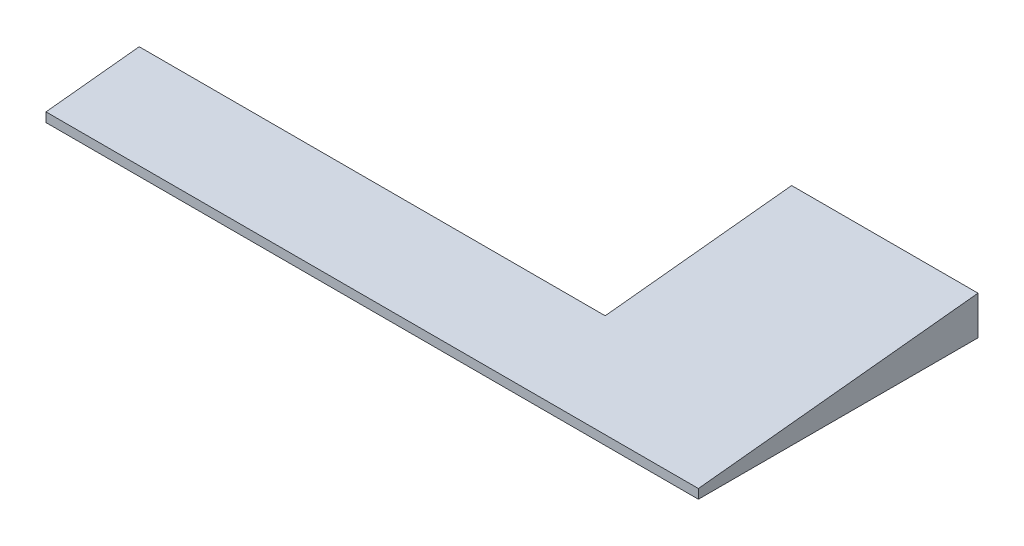
ISO-10303-21;
HEADER;
FILE_DESCRIPTION(('STEP AP214'),'2;1');
FILE_NAME('part.step','',(''),(''),'','','');
FILE_SCHEMA(('AUTOMOTIVE_DESIGN { 1 0 10303 214 1 1 1 1 }'));
ENDSEC;
DATA;
#1=APPLICATION_CONTEXT('core data for automotive mechanical design processes');
#2=APPLICATION_PROTOCOL_DEFINITION('international standard','automotive_design',2000,#1);
#3=PRODUCT_CONTEXT('',#1,'mechanical');
#4=PRODUCT('Part','Part','',(#3));
#5=PRODUCT_RELATED_PRODUCT_CATEGORY('part','',(#4));
#6=PRODUCT_DEFINITION_FORMATION('','',#4);
#7=PRODUCT_DEFINITION_CONTEXT('part definition',#1,'design');
#8=PRODUCT_DEFINITION('design','',#6,#7);
#9=PRODUCT_DEFINITION_SHAPE('','',#8);
#10=(LENGTH_UNIT() NAMED_UNIT(*) SI_UNIT(.MILLI.,.METRE.));
#11=(NAMED_UNIT(*) PLANE_ANGLE_UNIT() SI_UNIT($,.RADIAN.));
#12=(NAMED_UNIT(*) SI_UNIT($,.STERADIAN.) SOLID_ANGLE_UNIT());
#13=UNCERTAINTY_MEASURE_WITH_UNIT(LENGTH_MEASURE(1.E-05),#10,'distance_accuracy_value','');
#14=(GEOMETRIC_REPRESENTATION_CONTEXT(3) GLOBAL_UNCERTAINTY_ASSIGNED_CONTEXT((#13)) GLOBAL_UNIT_ASSIGNED_CONTEXT((#10,
#11,#12)) REPRESENTATION_CONTEXT('',''));
#15=CARTESIAN_POINT('',(0.,0.,0.));
#16=DIRECTION('',(0.,0.,1.));
#17=DIRECTION('',(1.,0.,0.));
#18=AXIS2_PLACEMENT_3D('',#15,#16,#17);
#19=CARTESIAN_POINT('',(0.,15.24,0.));
#20=DIRECTION('',(1.,0.,0.));
#21=DIRECTION('',(0.,0.,-1.));
#22=AXIS2_PLACEMENT_3D('',#19,#20,#21);
#23=PLANE('',#22);
#24=DIRECTION('',(0.,-1.,0.));
#25=VECTOR('',#24,1.);
#26=CARTESIAN_POINT('',(0.,15.24,0.));
#27=LINE('',#26,#25);
#28=CARTESIAN_POINT('',(0.,2.53999999999915,0.));
#29=VERTEX_POINT('',#28);
#30=CARTESIAN_POINT('',(0.,0.,0.));
#31=VERTEX_POINT('',#30);
#32=EDGE_CURVE('E86',#29,#31,#27,.T.);
#33=ORIENTED_EDGE('',*,*,#32,.F.);
#34=DIRECTION('',(0.,-0.104528463267651,0.994521895368274));
#35=VECTOR('',#34,1.);
#36=CARTESIAN_POINT('',(0.,15.24,-120.832428568638));
#37=LINE('',#36,#35);
#38=CARTESIAN_POINT('',(0.,5.20964757574726,-25.4));
#39=VERTEX_POINT('',#38);
#40=EDGE_CURVE('E57',#29,#39,#37,.F.);
#41=ORIENTED_EDGE('',*,*,#40,.T.);
#42=DIRECTION('',(0.,-1.,0.));
#43=VECTOR('',#42,1.);
#44=CARTESIAN_POINT('',(0.,15.24,-25.4));
#45=LINE('',#44,#43);
#46=CARTESIAN_POINT('',(0.,0.,-25.4));
#47=VERTEX_POINT('',#46);
#48=EDGE_CURVE('E107',#39,#47,#45,.T.);
#49=ORIENTED_EDGE('',*,*,#48,.T.);
#50=DIRECTION('',(0.,0.,1.));
#51=VECTOR('',#50,1.);
#52=CARTESIAN_POINT('',(0.,0.,0.));
#53=LINE('',#52,#51);
#54=EDGE_CURVE('E102',#47,#31,#53,.T.);
#55=ORIENTED_EDGE('',*,*,#54,.T.);
#56=EDGE_LOOP('',(#33,#41,#49,#55));
#57=FACE_BOUND('',#56,.T.);
#58=ADVANCED_FACE('F35',(#57),#23,.F.);
#59=CARTESIAN_POINT('',(0.,15.24,0.));
#60=DIRECTION('',(0.,0.,-1.));
#61=DIRECTION('',(-1.,0.,0.));
#62=AXIS2_PLACEMENT_3D('',#59,#60,#61);
#63=PLANE('',#62);
#64=DIRECTION('',(0.,-1.,0.));
#65=VECTOR('',#64,1.);
#66=CARTESIAN_POINT('',(177.8,15.24,0.));
#67=LINE('',#66,#65);
#68=CARTESIAN_POINT('',(177.8,2.53999999999915,0.));
#69=VERTEX_POINT('',#68);
#70=CARTESIAN_POINT('',(177.8,0.,0.));
#71=VERTEX_POINT('',#70);
#72=EDGE_CURVE('E96',#69,#71,#67,.T.);
#73=ORIENTED_EDGE('',*,*,#72,.F.);
#74=DIRECTION('',(-1.,0.,0.));
#75=VECTOR('',#74,1.);
#76=CARTESIAN_POINT('',(0.,2.53999999999915,0.));
#77=LINE('',#76,#75);
#78=EDGE_CURVE('E93',#69,#29,#77,.T.);
#79=ORIENTED_EDGE('',*,*,#78,.T.);
#80=ORIENTED_EDGE('',*,*,#32,.T.);
#81=DIRECTION('',(1.,0.,0.));
#82=VECTOR('',#81,1.);
#83=CARTESIAN_POINT('',(0.,0.,0.));
#84=LINE('',#83,#82);
#85=EDGE_CURVE('E90',#31,#71,#84,.T.);
#86=ORIENTED_EDGE('',*,*,#85,.T.);
#87=EDGE_LOOP('',(#73,#79,#80,#86));
#88=FACE_BOUND('',#87,.T.);
#89=ADVANCED_FACE('F89',(#88),#63,.F.);
#90=CARTESIAN_POINT('',(177.8,15.24,0.));
#91=DIRECTION('',(-1.,0.,0.));
#92=DIRECTION('',(0.,0.,1.));
#93=AXIS2_PLACEMENT_3D('',#90,#91,#92);
#94=PLANE('',#93);
#95=DIRECTION('',(0.,-1.,0.));
#96=VECTOR('',#95,1.);
#97=CARTESIAN_POINT('',(177.8,15.24,-76.2));
#98=LINE('',#97,#96);
#99=CARTESIAN_POINT('',(177.8,10.5489427272435,-76.2));
#100=VERTEX_POINT('',#99);
#101=CARTESIAN_POINT('',(177.8,0.,-76.2));
#102=VERTEX_POINT('',#101);
#103=EDGE_CURVE('E125',#100,#102,#98,.T.);
#104=ORIENTED_EDGE('',*,*,#103,.F.);
#105=DIRECTION('',(0.,0.104528463267651,-0.994521895368274));
#106=VECTOR('',#105,1.);
#107=CARTESIAN_POINT('',(177.8,15.24,-120.832428568638));
#108=LINE('',#107,#106);
#109=EDGE_CURVE('E129',#100,#69,#108,.F.);
#110=ORIENTED_EDGE('',*,*,#109,.T.);
#111=ORIENTED_EDGE('',*,*,#72,.T.);
#112=DIRECTION('',(0.,0.,-1.));
#113=VECTOR('',#112,1.);
#114=CARTESIAN_POINT('',(177.8,0.,0.));
#115=LINE('',#114,#113);
#116=EDGE_CURVE('E105',#71,#102,#115,.T.);
#117=ORIENTED_EDGE('',*,*,#116,.T.);
#118=EDGE_LOOP('',(#104,#110,#111,#117));
#119=FACE_BOUND('',#118,.T.);
#120=ADVANCED_FACE('F135',(#119),#94,.F.);
#121=CARTESIAN_POINT('',(127.,15.24,-76.2));
#122=DIRECTION('',(0.,0.,1.));
#123=DIRECTION('',(1.,0.,0.));
#124=AXIS2_PLACEMENT_3D('',#121,#122,#123);
#125=PLANE('',#124);
#126=DIRECTION('',(0.,-1.,0.));
#127=VECTOR('',#126,1.);
#128=CARTESIAN_POINT('',(127.,15.24,-76.2));
#129=LINE('',#128,#127);
#130=CARTESIAN_POINT('',(127.,10.5489427272435,-76.2));
#131=VERTEX_POINT('',#130);
#132=CARTESIAN_POINT('',(127.,0.,-76.2));
#133=VERTEX_POINT('',#132);
#134=EDGE_CURVE('E123',#131,#133,#129,.T.);
#135=ORIENTED_EDGE('',*,*,#134,.F.);
#136=DIRECTION('',(-1.,0.,0.));
#137=VECTOR('',#136,1.);
#138=CARTESIAN_POINT('',(0.,10.5489427272435,-76.2000000000002));
#139=LINE('',#138,#137);
#140=EDGE_CURVE('E95',#131,#100,#139,.F.);
#141=ORIENTED_EDGE('',*,*,#140,.T.);
#142=ORIENTED_EDGE('',*,*,#103,.T.);
#143=DIRECTION('',(-1.,0.,0.));
#144=VECTOR('',#143,1.);
#145=CARTESIAN_POINT('',(127.,0.,-76.2));
#146=LINE('',#145,#144);
#147=EDGE_CURVE('E112',#102,#133,#146,.T.);
#148=ORIENTED_EDGE('',*,*,#147,.T.);
#149=EDGE_LOOP('',(#135,#141,#142,#148));
#150=FACE_BOUND('',#149,.T.);
#151=ADVANCED_FACE('F143',(#150),#125,.F.);
#152=CARTESIAN_POINT('',(127.,15.24,-76.2));
#153=DIRECTION('',(1.,0.,0.));
#154=DIRECTION('',(0.,0.,-1.));
#155=AXIS2_PLACEMENT_3D('',#152,#153,#154);
#156=PLANE('',#155);
#157=DIRECTION('',(0.,-1.,0.));
#158=VECTOR('',#157,1.);
#159=CARTESIAN_POINT('',(127.,15.24,-25.4));
#160=LINE('',#159,#158);
#161=CARTESIAN_POINT('',(127.,5.20964757574726,-25.4));
#162=VERTEX_POINT('',#161);
#163=CARTESIAN_POINT('',(127.,0.,-25.4));
#164=VERTEX_POINT('',#163);
#165=EDGE_CURVE('E121',#162,#164,#160,.T.);
#166=ORIENTED_EDGE('',*,*,#165,.F.);
#167=DIRECTION('',(0.,-0.104528463267651,0.994521895368274));
#168=VECTOR('',#167,1.);
#169=CARTESIAN_POINT('',(127.,15.24,-120.832428568638));
#170=LINE('',#169,#168);
#171=EDGE_CURVE('E11',#162,#131,#170,.F.);
#172=ORIENTED_EDGE('',*,*,#171,.T.);
#173=ORIENTED_EDGE('',*,*,#134,.T.);
#174=DIRECTION('',(0.,0.,1.));
#175=VECTOR('',#174,1.);
#176=CARTESIAN_POINT('',(127.,0.,-76.2));
#177=LINE('',#176,#175);
#178=EDGE_CURVE('E115',#133,#164,#177,.T.);
#179=ORIENTED_EDGE('',*,*,#178,.T.);
#180=EDGE_LOOP('',(#166,#172,#173,#179));
#181=FACE_BOUND('',#180,.T.);
#182=ADVANCED_FACE('F141',(#181),#156,.F.);
#183=CARTESIAN_POINT('',(0.,15.24,-25.4));
#184=DIRECTION('',(0.,0.,1.));
#185=DIRECTION('',(1.,0.,0.));
#186=AXIS2_PLACEMENT_3D('',#183,#184,#185);
#187=PLANE('',#186);
#188=ORIENTED_EDGE('',*,*,#48,.F.);
#189=DIRECTION('',(-1.,0.,0.));
#190=VECTOR('',#189,1.);
#191=CARTESIAN_POINT('',(0.,5.20964757574725,-25.4));
#192=LINE('',#191,#190);
#193=EDGE_CURVE('E43',#39,#162,#192,.F.);
#194=ORIENTED_EDGE('',*,*,#193,.T.);
#195=ORIENTED_EDGE('',*,*,#165,.T.);
#196=DIRECTION('',(-1.,0.,0.));
#197=VECTOR('',#196,1.);
#198=CARTESIAN_POINT('',(0.,0.,-25.4));
#199=LINE('',#198,#197);
#200=EDGE_CURVE('E118',#164,#47,#199,.T.);
#201=ORIENTED_EDGE('',*,*,#200,.T.);
#202=EDGE_LOOP('',(#188,#194,#195,#201));
#203=FACE_BOUND('',#202,.T.);
#204=ADVANCED_FACE('F145',(#203),#187,.F.);
#205=CARTESIAN_POINT('',(0.,0.,0.));
#206=DIRECTION('',(0.,-1.,0.));
#207=DIRECTION('',(0.,0.,-1.));
#208=AXIS2_PLACEMENT_3D('',#205,#206,#207);
#209=PLANE('',#208);
#210=ORIENTED_EDGE('',*,*,#54,.F.);
#211=ORIENTED_EDGE('',*,*,#200,.F.);
#212=ORIENTED_EDGE('',*,*,#178,.F.);
#213=ORIENTED_EDGE('',*,*,#147,.F.);
#214=ORIENTED_EDGE('',*,*,#116,.F.);
#215=ORIENTED_EDGE('',*,*,#85,.F.);
#216=EDGE_LOOP('',(#210,#211,#212,#213,#214,#215));
#217=FACE_BOUND('',#216,.T.);
#218=ADVANCED_FACE('F100',(#217),#209,.T.);
#219=CARTESIAN_POINT('',(0.,15.24,-120.832428568638));
#220=DIRECTION('',(0.,-0.994521895368274,-0.104528463267651));
#221=DIRECTION('',(1.,0.,0.));
#222=AXIS2_PLACEMENT_3D('',#219,#220,#221);
#223=PLANE('',#222);
#224=ORIENTED_EDGE('',*,*,#40,.F.);
#225=ORIENTED_EDGE('',*,*,#78,.F.);
#226=ORIENTED_EDGE('',*,*,#109,.F.);
#227=ORIENTED_EDGE('',*,*,#140,.F.);
#228=ORIENTED_EDGE('',*,*,#171,.F.);
#229=ORIENTED_EDGE('',*,*,#193,.F.);
#230=EDGE_LOOP('',(#224,#225,#226,#227,#228,#229));
#231=FACE_BOUND('',#230,.T.);
#232=ADVANCED_FACE('F37',(#231),#223,.F.);
#233=CLOSED_SHELL('',(#58,#89,#120,#151,#182,#204,#218,#232));
#234=MANIFOLD_SOLID_BREP('B2',#233);
#235=ADVANCED_BREP_SHAPE_REPRESENTATION('',(#18,#234),#14);
#236=SHAPE_DEFINITION_REPRESENTATION(#9,#235);
ENDSEC;
END-ISO-10303-21;
